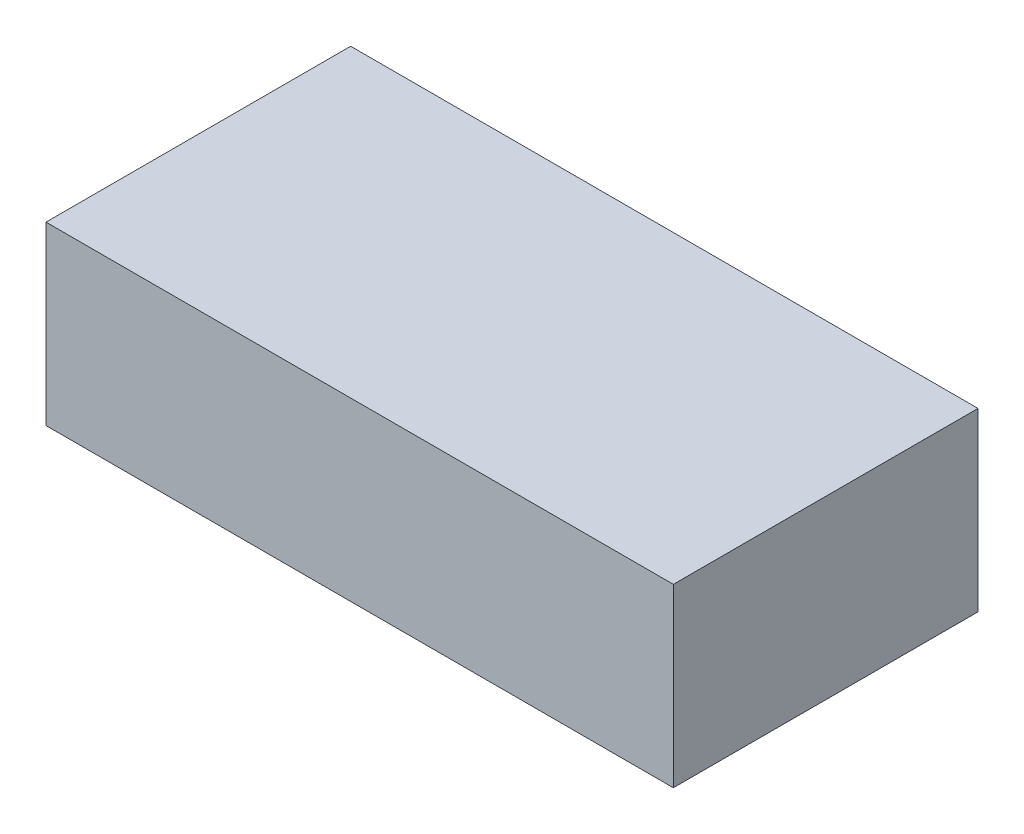
ISO-10303-21;
HEADER;
FILE_DESCRIPTION(('STEP AP214'),'2;1');
FILE_NAME('part.step','',(''),(''),'','','');
FILE_SCHEMA(('AUTOMOTIVE_DESIGN { 1 0 10303 214 1 1 1 1 }'));
ENDSEC;
DATA;
#1=APPLICATION_CONTEXT('core data for automotive mechanical design processes');
#2=APPLICATION_PROTOCOL_DEFINITION('international standard','automotive_design',2000,#1);
#3=PRODUCT_CONTEXT('',#1,'mechanical');
#4=PRODUCT('Part','Part','',(#3));
#5=PRODUCT_RELATED_PRODUCT_CATEGORY('part','',(#4));
#6=PRODUCT_DEFINITION_FORMATION('','',#4);
#7=PRODUCT_DEFINITION_CONTEXT('part definition',#1,'design');
#8=PRODUCT_DEFINITION('design','',#6,#7);
#9=PRODUCT_DEFINITION_SHAPE('','',#8);
#10=(LENGTH_UNIT() NAMED_UNIT(*) SI_UNIT(.MILLI.,.METRE.));
#11=(NAMED_UNIT(*) PLANE_ANGLE_UNIT() SI_UNIT($,.RADIAN.));
#12=(NAMED_UNIT(*) SI_UNIT($,.STERADIAN.) SOLID_ANGLE_UNIT());
#13=UNCERTAINTY_MEASURE_WITH_UNIT(LENGTH_MEASURE(1.E-05),#10,'distance_accuracy_value','');
#14=(GEOMETRIC_REPRESENTATION_CONTEXT(3) GLOBAL_UNCERTAINTY_ASSIGNED_CONTEXT((#13)) GLOBAL_UNIT_ASSIGNED_CONTEXT((#10,
#11,#12)) REPRESENTATION_CONTEXT('',''));
#15=CARTESIAN_POINT('',(0.,0.,0.));
#16=DIRECTION('',(0.,0.,1.));
#17=DIRECTION('',(1.,0.,0.));
#18=AXIS2_PLACEMENT_3D('',#15,#16,#17);
#19=CARTESIAN_POINT('',(0.,13.4112,0.));
#20=DIRECTION('',(1.,0.,0.));
#21=DIRECTION('',(0.,0.,-1.));
#22=AXIS2_PLACEMENT_3D('',#19,#20,#21);
#23=PLANE('',#22);
#24=DIRECTION('',(0.,0.,1.));
#25=VECTOR('',#24,1.);
#26=CARTESIAN_POINT('',(0.,0.,0.));
#27=LINE('',#26,#25);
#28=CARTESIAN_POINT('',(0.,0.,-23.1902));
#29=VERTEX_POINT('',#28);
#30=CARTESIAN_POINT('',(0.,0.,0.));
#31=VERTEX_POINT('',#30);
#32=EDGE_CURVE('E107',#29,#31,#27,.T.);
#33=ORIENTED_EDGE('',*,*,#32,.T.);
#34=DIRECTION('',(0.,-1.,0.));
#35=VECTOR('',#34,1.);
#36=CARTESIAN_POINT('',(0.,13.4112,0.));
#37=LINE('',#36,#35);
#38=CARTESIAN_POINT('',(0.,13.4112,0.));
#39=VERTEX_POINT('',#38);
#40=EDGE_CURVE('E11',#39,#31,#37,.T.);
#41=ORIENTED_EDGE('',*,*,#40,.F.);
#42=DIRECTION('',(0.,0.,1.));
#43=VECTOR('',#42,1.);
#44=CARTESIAN_POINT('',(0.,13.4112,0.));
#45=LINE('',#44,#43);
#46=CARTESIAN_POINT('',(0.,13.4112,-23.1902));
#47=VERTEX_POINT('',#46);
#48=EDGE_CURVE('E91',#47,#39,#45,.T.);
#49=ORIENTED_EDGE('',*,*,#48,.F.);
#50=DIRECTION('',(0.,-1.,0.));
#51=VECTOR('',#50,1.);
#52=CARTESIAN_POINT('',(0.,13.4112,-23.1902));
#53=LINE('',#52,#51);
#54=EDGE_CURVE('E103',#47,#29,#53,.T.);
#55=ORIENTED_EDGE('',*,*,#54,.T.);
#56=EDGE_LOOP('',(#33,#41,#49,#55));
#57=FACE_BOUND('',#56,.T.);
#58=ADVANCED_FACE('F39',(#57),#23,.F.);
#59=CARTESIAN_POINT('',(0.,13.4112,0.));
#60=DIRECTION('',(0.,0.,-1.));
#61=DIRECTION('',(-1.,0.,0.));
#62=AXIS2_PLACEMENT_3D('',#59,#60,#61);
#63=PLANE('',#62);
#64=DIRECTION('',(1.,0.,0.));
#65=VECTOR('',#64,1.);
#66=CARTESIAN_POINT('',(0.,0.,0.));
#67=LINE('',#66,#65);
#68=CARTESIAN_POINT('',(47.752,0.,0.));
#69=VERTEX_POINT('',#68);
#70=EDGE_CURVE('E96',#31,#69,#67,.T.);
#71=ORIENTED_EDGE('',*,*,#70,.T.);
#72=DIRECTION('',(0.,-1.,0.));
#73=VECTOR('',#72,1.);
#74=CARTESIAN_POINT('',(47.752,13.4112,0.));
#75=LINE('',#74,#73);
#76=CARTESIAN_POINT('',(47.752,13.4112,0.));
#77=VERTEX_POINT('',#76);
#78=EDGE_CURVE('E48',#77,#69,#75,.T.);
#79=ORIENTED_EDGE('',*,*,#78,.F.);
#80=DIRECTION('',(1.,0.,0.));
#81=VECTOR('',#80,1.);
#82=CARTESIAN_POINT('',(0.,13.4112,0.));
#83=LINE('',#82,#81);
#84=EDGE_CURVE('E86',#39,#77,#83,.T.);
#85=ORIENTED_EDGE('',*,*,#84,.F.);
#86=ORIENTED_EDGE('',*,*,#40,.T.);
#87=EDGE_LOOP('',(#71,#79,#85,#86));
#88=FACE_BOUND('',#87,.T.);
#89=ADVANCED_FACE('F95',(#88),#63,.F.);
#90=CARTESIAN_POINT('',(47.752,13.4112,0.));
#91=DIRECTION('',(-1.,0.,0.));
#92=DIRECTION('',(0.,0.,1.));
#93=AXIS2_PLACEMENT_3D('',#90,#91,#92);
#94=PLANE('',#93);
#95=DIRECTION('',(0.,0.,-1.));
#96=VECTOR('',#95,1.);
#97=CARTESIAN_POINT('',(47.752,0.,0.));
#98=LINE('',#97,#96);
#99=CARTESIAN_POINT('',(47.752,0.,-23.1902));
#100=VERTEX_POINT('',#99);
#101=EDGE_CURVE('E73',#69,#100,#98,.T.);
#102=ORIENTED_EDGE('',*,*,#101,.T.);
#103=DIRECTION('',(0.,-1.,0.));
#104=VECTOR('',#103,1.);
#105=CARTESIAN_POINT('',(47.752,13.4112,-23.1902));
#106=LINE('',#105,#104);
#107=CARTESIAN_POINT('',(47.752,13.4112,-23.1902));
#108=VERTEX_POINT('',#107);
#109=EDGE_CURVE('E98',#108,#100,#106,.T.);
#110=ORIENTED_EDGE('',*,*,#109,.F.);
#111=DIRECTION('',(0.,0.,-1.));
#112=VECTOR('',#111,1.);
#113=CARTESIAN_POINT('',(47.752,13.4112,0.));
#114=LINE('',#113,#112);
#115=EDGE_CURVE('E89',#77,#108,#114,.T.);
#116=ORIENTED_EDGE('',*,*,#115,.F.);
#117=ORIENTED_EDGE('',*,*,#78,.T.);
#118=EDGE_LOOP('',(#102,#110,#116,#117));
#119=FACE_BOUND('',#118,.T.);
#120=ADVANCED_FACE('F99',(#119),#94,.F.);
#121=CARTESIAN_POINT('',(0.,13.4112,-23.1902));
#122=DIRECTION('',(0.,0.,1.));
#123=DIRECTION('',(1.,0.,0.));
#124=AXIS2_PLACEMENT_3D('',#121,#122,#123);
#125=PLANE('',#124);
#126=DIRECTION('',(-1.,0.,0.));
#127=VECTOR('',#126,1.);
#128=CARTESIAN_POINT('',(0.,0.,-23.1902));
#129=LINE('',#128,#127);
#130=EDGE_CURVE('E79',#100,#29,#129,.T.);
#131=ORIENTED_EDGE('',*,*,#130,.T.);
#132=ORIENTED_EDGE('',*,*,#54,.F.);
#133=DIRECTION('',(-1.,0.,0.));
#134=VECTOR('',#133,1.);
#135=CARTESIAN_POINT('',(0.,13.4112,-23.1902));
#136=LINE('',#135,#134);
#137=EDGE_CURVE('E56',#108,#47,#136,.T.);
#138=ORIENTED_EDGE('',*,*,#137,.F.);
#139=ORIENTED_EDGE('',*,*,#109,.T.);
#140=EDGE_LOOP('',(#131,#132,#138,#139));
#141=FACE_BOUND('',#140,.T.);
#142=ADVANCED_FACE('F120',(#141),#125,.F.);
#143=CARTESIAN_POINT('',(0.,13.4112,0.));
#144=DIRECTION('',(0.,-1.,0.));
#145=DIRECTION('',(0.,0.,-1.));
#146=AXIS2_PLACEMENT_3D('',#143,#144,#145);
#147=PLANE('',#146);
#148=ORIENTED_EDGE('',*,*,#48,.T.);
#149=ORIENTED_EDGE('',*,*,#84,.T.);
#150=ORIENTED_EDGE('',*,*,#115,.T.);
#151=ORIENTED_EDGE('',*,*,#137,.T.);
#152=EDGE_LOOP('',(#148,#149,#150,#151));
#153=FACE_BOUND('',#152,.T.);
#154=ADVANCED_FACE('F87',(#153),#147,.F.);
#155=CARTESIAN_POINT('',(0.,0.,0.));
#156=DIRECTION('',(0.,-1.,0.));
#157=DIRECTION('',(0.,0.,-1.));
#158=AXIS2_PLACEMENT_3D('',#155,#156,#157);
#159=PLANE('',#158);
#160=ORIENTED_EDGE('',*,*,#32,.F.);
#161=ORIENTED_EDGE('',*,*,#130,.F.);
#162=ORIENTED_EDGE('',*,*,#101,.F.);
#163=ORIENTED_EDGE('',*,*,#70,.F.);
#164=EDGE_LOOP('',(#160,#161,#162,#163));
#165=FACE_BOUND('',#164,.T.);
#166=ADVANCED_FACE('F123',(#165),#159,.T.);
#167=CLOSED_SHELL('',(#58,#89,#120,#142,#154,#166));
#168=MANIFOLD_SOLID_BREP('B2',#167);
#169=ADVANCED_BREP_SHAPE_REPRESENTATION('',(#18,#168),#14);
#170=SHAPE_DEFINITION_REPRESENTATION(#9,#169);
ENDSEC;
END-ISO-10303-21;
